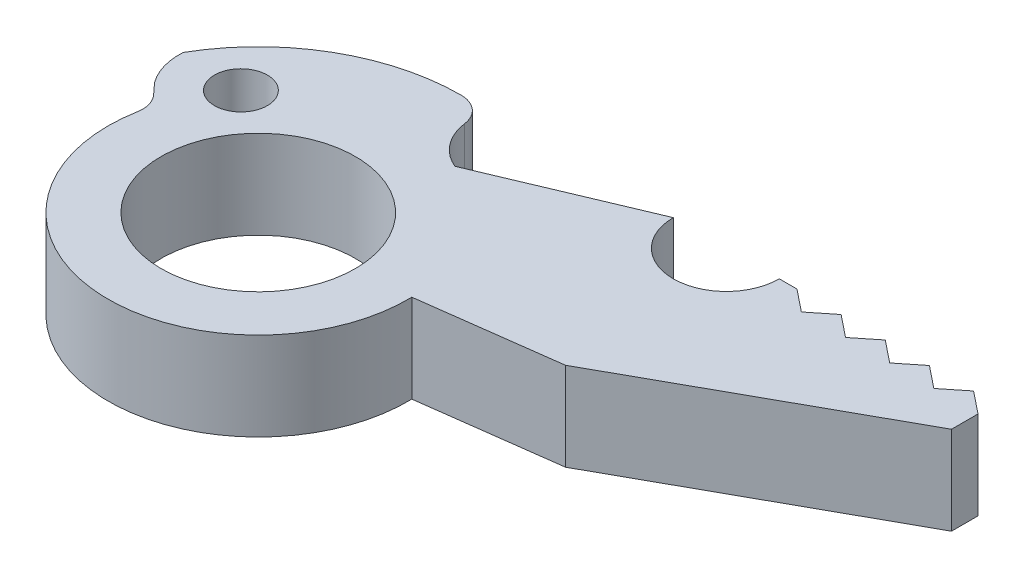
ISO-10303-21;
HEADER;
FILE_DESCRIPTION(('STEP AP214'),'2;1');
FILE_NAME('part.step','',(''),(''),'','','');
FILE_SCHEMA(('AUTOMOTIVE_DESIGN { 1 0 10303 214 1 1 1 1 }'));
ENDSEC;
DATA;
#1=APPLICATION_CONTEXT('core data for automotive mechanical design processes');
#2=APPLICATION_PROTOCOL_DEFINITION('international standard','automotive_design',2000,#1);
#3=PRODUCT_CONTEXT('',#1,'mechanical');
#4=PRODUCT('Part','Part','',(#3));
#5=PRODUCT_RELATED_PRODUCT_CATEGORY('part','',(#4));
#6=PRODUCT_DEFINITION_FORMATION('','',#4);
#7=PRODUCT_DEFINITION_CONTEXT('part definition',#1,'design');
#8=PRODUCT_DEFINITION('design','',#6,#7);
#9=PRODUCT_DEFINITION_SHAPE('','',#8);
#10=(LENGTH_UNIT() NAMED_UNIT(*) SI_UNIT(.MILLI.,.METRE.));
#11=(NAMED_UNIT(*) PLANE_ANGLE_UNIT() SI_UNIT($,.RADIAN.));
#12=(NAMED_UNIT(*) SI_UNIT($,.STERADIAN.) SOLID_ANGLE_UNIT());
#13=UNCERTAINTY_MEASURE_WITH_UNIT(LENGTH_MEASURE(1.E-05),#10,'distance_accuracy_value','');
#14=(GEOMETRIC_REPRESENTATION_CONTEXT(3) GLOBAL_UNCERTAINTY_ASSIGNED_CONTEXT((#13)) GLOBAL_UNIT_ASSIGNED_CONTEXT((#10,
#11,#12)) REPRESENTATION_CONTEXT('',''));
#15=CARTESIAN_POINT('',(0.,0.,0.));
#16=DIRECTION('',(0.,0.,1.));
#17=DIRECTION('',(1.,0.,0.));
#18=AXIS2_PLACEMENT_3D('',#15,#16,#17);
#19=CARTESIAN_POINT('',(0.,5.,0.));
#20=DIRECTION('',(0.,-1.,0.));
#21=DIRECTION('',(0.,0.,-1.));
#22=AXIS2_PLACEMENT_3D('',#19,#20,#21);
#23=CYLINDRICAL_SURFACE('',#22,11.5);
#24=DIRECTION('',(0.,1.,0.));
#25=VECTOR('',#24,1.);
#26=CARTESIAN_POINT('',(-9.9734779076788,0.,-5.72535923982442));
#27=LINE('',#26,#25);
#28=CARTESIAN_POINT('',(-9.9734779076788,0.,-5.72535923982442));
#29=VERTEX_POINT('',#28);
#30=CARTESIAN_POINT('',(-9.9734779076788,5.,-5.72535923982442));
#31=VERTEX_POINT('',#30);
#32=EDGE_CURVE('E50',#29,#31,#27,.T.);
#33=ORIENTED_EDGE('',*,*,#32,.T.);
#34=CARTESIAN_POINT('',(0.,5.,0.));
#35=DIRECTION('',(0.,1.,0.));
#36=DIRECTION('',(0.,0.,1.));
#37=AXIS2_PLACEMENT_3D('',#34,#35,#36);
#38=CIRCLE('',#37,11.5);
#39=CARTESIAN_POINT('',(0.,5.,-11.5));
#40=VERTEX_POINT('',#39);
#41=EDGE_CURVE('E185',#40,#31,#38,.T.);
#42=ORIENTED_EDGE('',*,*,#41,.F.);
#43=DIRECTION('',(0.,-1.,0.));
#44=VECTOR('',#43,1.);
#45=CARTESIAN_POINT('',(0.,5.,-11.5));
#46=LINE('',#45,#44);
#47=CARTESIAN_POINT('',(0.,0.,-11.5));
#48=VERTEX_POINT('',#47);
#49=EDGE_CURVE('E189',#40,#48,#46,.T.);
#50=ORIENTED_EDGE('',*,*,#49,.T.);
#51=CARTESIAN_POINT('',(0.,0.,0.));
#52=DIRECTION('',(0.,1.,0.));
#53=DIRECTION('',(0.,0.,1.));
#54=AXIS2_PLACEMENT_3D('',#51,#52,#53);
#55=CIRCLE('',#54,11.5);
#56=EDGE_CURVE('E307',#48,#29,#55,.T.);
#57=ORIENTED_EDGE('',*,*,#56,.T.);
#58=EDGE_LOOP('',(#33,#42,#50,#57));
#59=FACE_BOUND('',#58,.T.);
#60=ADVANCED_FACE('F35',(#59),#23,.T.);
#61=CARTESIAN_POINT('',(-3.35381852195937,5.,3.06906521636058));
#62=DIRECTION('',(-0.737731126238282,0.,0.675094649200537));
#63=DIRECTION('',(0.675094649200537,0.,0.737731126238282));
#64=AXIS2_PLACEMENT_3D('',#61,#62,#63);
#65=PLANE('',#64);
#66=DIRECTION('',(-0.675094649200537,0.,-0.737731126238282));
#67=VECTOR('',#66,1.);
#68=CARTESIAN_POINT('',(-3.35381852195937,5.,3.06906521636058));
#69=LINE('',#68,#67);
#70=CARTESIAN_POINT('',(-8.73108036714643,5.,-2.80710850509576));
#71=VERTEX_POINT('',#70);
#72=CARTESIAN_POINT('',(-9.31054111356985,5.,-3.44033264570488));
#73=VERTEX_POINT('',#72);
#74=EDGE_CURVE('E194',#71,#73,#69,.T.);
#75=ORIENTED_EDGE('',*,*,#74,.T.);
#76=DIRECTION('',(0.,1.,0.));
#77=VECTOR('',#76,1.);
#78=CARTESIAN_POINT('',(-9.31054111356985,0.,-3.44033264570488));
#79=LINE('',#78,#77);
#80=CARTESIAN_POINT('',(-9.31054111356985,0.,-3.44033264570488));
#81=VERTEX_POINT('',#80);
#82=EDGE_CURVE('E329',#81,#73,#79,.T.);
#83=ORIENTED_EDGE('',*,*,#82,.F.);
#84=DIRECTION('',(-0.675094649200537,0.,-0.737731126238282));
#85=VECTOR('',#84,1.);
#86=CARTESIAN_POINT('',(-3.35381852195937,0.,3.06906521636058));
#87=LINE('',#86,#85);
#88=CARTESIAN_POINT('',(-8.73108036714643,0.,-2.80710850509576));
#89=VERTEX_POINT('',#88);
#90=EDGE_CURVE('E309',#89,#81,#87,.T.);
#91=ORIENTED_EDGE('',*,*,#90,.F.);
#92=DIRECTION('',(0.,-1.,0.));
#93=VECTOR('',#92,1.);
#94=CARTESIAN_POINT('',(-8.73108036714643,5.,-2.80710850509576));
#95=LINE('',#94,#93);
#96=EDGE_CURVE('E208',#71,#89,#95,.T.);
#97=ORIENTED_EDGE('',*,*,#96,.F.);
#98=EDGE_LOOP('',(#75,#83,#91,#97));
#99=FACE_BOUND('',#98,.T.);
#100=ADVANCED_FACE('F337',(#99),#65,.T.);
#101=CARTESIAN_POINT('',(0.,5.,0.));
#102=DIRECTION('',(0.,1.,0.));
#103=DIRECTION('',(0.,0.,1.));
#104=AXIS2_PLACEMENT_3D('',#101,#102,#103);
#105=PLANE('',#104);
#106=CARTESIAN_POINT('',(0.,5.,0.));
#107=DIRECTION('',(0.,1.,0.));
#108=DIRECTION('',(0.,0.,1.));
#109=AXIS2_PLACEMENT_3D('',#106,#107,#108);
#110=CIRCLE('',#109,5.5);
#111=CARTESIAN_POINT('',(0.,5.,5.5));
#112=VERTEX_POINT('',#111);
#113=EDGE_CURVE('E317',#112,#112,#110,.T.);
#114=ORIENTED_EDGE('',*,*,#113,.F.);
#115=EDGE_LOOP('',(#114));
#116=FACE_BOUND('',#115,.T.);
#117=CARTESIAN_POINT('',(-6.48074069840786,5.,-5.5));
#118=DIRECTION('',(0.,1.,0.));
#119=DIRECTION('',(0.,0.,1.));
#120=AXIS2_PLACEMENT_3D('',#117,#118,#119);
#121=CIRCLE('',#120,1.5);
#122=CARTESIAN_POINT('',(-6.48074069840786,5.,-4.));
#123=VERTEX_POINT('',#122);
#124=EDGE_CURVE('E318',#123,#123,#121,.T.);
#125=ORIENTED_EDGE('',*,*,#124,.F.);
#126=EDGE_LOOP('',(#125));
#127=FACE_BOUND('',#126,.T.);
#128=ORIENTED_EDGE('',*,*,#41,.T.);
#129=CARTESIAN_POINT('',(-6.48074069840786,5.,-5.5));
#130=DIRECTION('',(0.,1.,0.));
#131=DIRECTION('',(0.,0.,1.));
#132=AXIS2_PLACEMENT_3D('',#129,#130,#131);
#133=CIRCLE('',#132,3.5);
#134=EDGE_CURVE('E341',#31,#73,#133,.T.);
#135=ORIENTED_EDGE('',*,*,#134,.T.);
#136=ORIENTED_EDGE('',*,*,#74,.F.);
#137=CARTESIAN_POINT('',(-9.83767705650385,5.,-1.79446653129496));
#138=DIRECTION('',(0.,1.,0.));
#139=DIRECTION('',(0.,0.,1.));
#140=AXIS2_PLACEMENT_3D('',#137,#138,#139);
#141=CIRCLE('',#140,1.5);
#142=CARTESIAN_POINT('',(-8.36202549802827,5.,-1.52529655160071));
#143=VERTEX_POINT('',#142);
#144=EDGE_CURVE('E320',#143,#71,#141,.T.);
#145=ORIENTED_EDGE('',*,*,#144,.F.);
#146=CARTESIAN_POINT('',(0.,5.,0.));
#147=DIRECTION('',(0.,1.,0.));
#148=DIRECTION('',(0.,0.,1.));
#149=AXIS2_PLACEMENT_3D('',#146,#147,#148);
#150=CIRCLE('',#149,8.5);
#151=CARTESIAN_POINT('',(8.49770604584843,5.,-0.197463815295299));
#152=VERTEX_POINT('',#151);
#153=EDGE_CURVE('E350',#152,#143,#150,.F.);
#154=ORIENTED_EDGE('',*,*,#153,.F.);
#155=DIRECTION('',(-0.991420251946887,0.,0.13071298340093));
#156=VECTOR('',#155,1.);
#157=CARTESIAN_POINT('',(0.119601188207002,5.,0.907140492552552));
#158=LINE('',#157,#156);
#159=CARTESIAN_POINT('',(16.1869783902135,5.,-1.21124956996442));
#160=VERTEX_POINT('',#159);
#161=EDGE_CURVE('E352',#160,#152,#158,.T.);
#162=ORIENTED_EDGE('',*,*,#161,.F.);
#163=DIRECTION('',(-0.874791356085416,0.,0.484499827985769));
#164=VECTOR('',#163,1.);
#165=CARTESIAN_POINT('',(3.28636116645535,5.,5.9337076616555));
#166=LINE('',#165,#164);
#167=CARTESIAN_POINT('',(30.25,5.,-9.));
#168=VERTEX_POINT('',#167);
#169=EDGE_CURVE('E250',#168,#160,#166,.T.);
#170=ORIENTED_EDGE('',*,*,#169,.F.);
#171=DIRECTION('',(0.,0.,1.));
#172=VECTOR('',#171,1.);
#173=CARTESIAN_POINT('',(30.2500000000001,5.,-2.09901540593194E-13));
#174=LINE('',#173,#172);
#175=CARTESIAN_POINT('',(30.25,5.,-10.5));
#176=VERTEX_POINT('',#175);
#177=EDGE_CURVE('E355',#176,#168,#174,.T.);
#178=ORIENTED_EDGE('',*,*,#177,.F.);
#179=DIRECTION('',(0.78086880944303,0.,0.624695047554424));
#180=VECTOR('',#179,1.);
#181=CARTESIAN_POINT('',(16.9268292682927,5.,-21.1585365853659));
#182=LINE('',#181,#180);
#183=CARTESIAN_POINT('',(29.,5.,-11.5));
#184=VERTEX_POINT('',#183);
#185=EDGE_CURVE('E358',#184,#176,#182,.T.);
#186=ORIENTED_EDGE('',*,*,#185,.F.);
#187=DIRECTION('',(0.780868809443031,0.,-0.624695047554424));
#188=VECTOR('',#187,1.);
#189=CARTESIAN_POINT('',(5.70731707317071,5.,7.1341463414634));
#190=LINE('',#189,#188);
#191=CARTESIAN_POINT('',(27.75,5.,-10.5));
#192=VERTEX_POINT('',#191);
#193=EDGE_CURVE('E361',#192,#184,#190,.T.);
#194=ORIENTED_EDGE('',*,*,#193,.F.);
#195=DIRECTION('',(0.780868809443031,0.,0.624695047554424));
#196=VECTOR('',#195,1.);
#197=CARTESIAN_POINT('',(15.9512195121951,5.,-19.9390243902439));
#198=LINE('',#197,#196);
#199=CARTESIAN_POINT('',(26.5,5.,-11.5));
#200=VERTEX_POINT('',#199);
#201=EDGE_CURVE('E364',#200,#192,#198,.T.);
#202=ORIENTED_EDGE('',*,*,#201,.F.);
#203=DIRECTION('',(0.78086880944303,0.,-0.624695047554425));
#204=VECTOR('',#203,1.);
#205=CARTESIAN_POINT('',(4.73170731707318,5.,5.91463414634147));
#206=LINE('',#205,#204);
#207=CARTESIAN_POINT('',(25.25,5.,-10.5));
#208=VERTEX_POINT('',#207);
#209=EDGE_CURVE('E367',#208,#200,#206,.T.);
#210=ORIENTED_EDGE('',*,*,#209,.F.);
#211=DIRECTION('',(0.780868809443031,0.,0.624695047554424));
#212=VECTOR('',#211,1.);
#213=CARTESIAN_POINT('',(14.9756097560975,5.,-18.719512195122));
#214=LINE('',#213,#212);
#215=CARTESIAN_POINT('',(24.,5.,-11.5));
#216=VERTEX_POINT('',#215);
#217=EDGE_CURVE('E370',#216,#208,#214,.T.);
#218=ORIENTED_EDGE('',*,*,#217,.F.);
#219=DIRECTION('',(0.780868809443031,0.,-0.624695047554424));
#220=VECTOR('',#219,1.);
#221=CARTESIAN_POINT('',(3.75609756097559,5.,4.6951219512195));
#222=LINE('',#221,#220);
#223=CARTESIAN_POINT('',(22.75,5.,-10.5));
#224=VERTEX_POINT('',#223);
#225=EDGE_CURVE('E373',#224,#216,#222,.T.);
#226=ORIENTED_EDGE('',*,*,#225,.F.);
#227=DIRECTION('',(0.78086880944303,0.,0.624695047554425));
#228=VECTOR('',#227,1.);
#229=CARTESIAN_POINT('',(14.,5.,-17.5));
#230=LINE('',#229,#228);
#231=CARTESIAN_POINT('',(21.5,5.,-11.5));
#232=VERTEX_POINT('',#231);
#233=EDGE_CURVE('E376',#232,#224,#230,.T.);
#234=ORIENTED_EDGE('',*,*,#233,.F.);
#235=DIRECTION('',(0.780868809443031,0.,-0.624695047554424));
#236=VECTOR('',#235,1.);
#237=CARTESIAN_POINT('',(2.78048780487803,5.,3.47560975609755));
#238=LINE('',#237,#236);
#239=CARTESIAN_POINT('',(20.25,5.,-10.5));
#240=VERTEX_POINT('',#239);
#241=EDGE_CURVE('E379',#240,#232,#238,.T.);
#242=ORIENTED_EDGE('',*,*,#241,.F.);
#243=DIRECTION('',(0.78086880944303,0.,0.624695047554425));
#244=VECTOR('',#243,1.);
#245=CARTESIAN_POINT('',(13.0243902439025,5.,-16.280487804878));
#246=LINE('',#245,#244);
#247=CARTESIAN_POINT('',(19.,5.,-11.5));
#248=VERTEX_POINT('',#247);
#249=EDGE_CURVE('E382',#248,#240,#246,.T.);
#250=ORIENTED_EDGE('',*,*,#249,.F.);
#251=DIRECTION('',(1.,0.,0.));
#252=VECTOR('',#251,1.);
#253=CARTESIAN_POINT('',(0.,5.,-11.5));
#254=LINE('',#253,#252);
#255=CARTESIAN_POINT('',(18.,5.,-11.5));
#256=VERTEX_POINT('',#255);
#257=EDGE_CURVE('E385',#256,#248,#254,.T.);
#258=ORIENTED_EDGE('',*,*,#257,.F.);
#259=CARTESIAN_POINT('',(15.,5.,-11.5));
#260=DIRECTION('',(0.,1.,0.));
#261=DIRECTION('',(0.,0.,1.));
#262=AXIS2_PLACEMENT_3D('',#259,#260,#261);
#263=CIRCLE('',#262,3.);
#264=CARTESIAN_POINT('',(12.,5.,-11.5));
#265=VERTEX_POINT('',#264);
#266=EDGE_CURVE('E388',#265,#256,#263,.T.);
#267=ORIENTED_EDGE('',*,*,#266,.F.);
#268=DIRECTION('',(-0.921614956126948,0.,0.388105491642574));
#269=VECTOR('',#268,1.);
#270=CARTESIAN_POINT('',(-2.30585352328969,5.,-5.47559655677049));
#271=LINE('',#270,#269);
#272=CARTESIAN_POINT('',(3.2963891570141,5.,-7.83478260869565));
#273=VERTEX_POINT('',#272);
#274=EDGE_CURVE('E391',#265,#273,#271,.T.);
#275=ORIENTED_EDGE('',*,*,#274,.T.);
#276=CARTESIAN_POINT('',(4.45982062419555,5.,-10.6));
#277=DIRECTION('',(0.,1.,0.));
#278=DIRECTION('',(0.,0.,1.));
#279=AXIS2_PLACEMENT_3D('',#276,#277,#278);
#280=CIRCLE('',#279,3.);
#281=CARTESIAN_POINT('',(1.48660687473185,5.,-10.2));
#282=VERTEX_POINT('',#281);
#283=EDGE_CURVE('E201',#282,#273,#280,.T.);
#284=ORIENTED_EDGE('',*,*,#283,.F.);
#285=CARTESIAN_POINT('',(0.,5.,-10.));
#286=DIRECTION('',(0.,1.,0.));
#287=DIRECTION('',(0.,0.,1.));
#288=AXIS2_PLACEMENT_3D('',#285,#286,#287);
#289=CIRCLE('',#288,1.5);
#290=EDGE_CURVE('E195',#282,#40,#289,.T.);
#291=ORIENTED_EDGE('',*,*,#290,.T.);
#292=EDGE_LOOP('',(#128,#135,#136,#145,#154,#162,#170,#178,#186,#194,#202,#210,#218,#226,#234,
#242,#250,#258,#267,#275,#284,#291));
#293=FACE_BOUND('',#292,.T.);
#294=ADVANCED_FACE('F199',(#116,#127,#293),#105,.T.);
#295=CARTESIAN_POINT('',(0.,0.,0.));
#296=DIRECTION('',(0.,1.,0.));
#297=DIRECTION('',(0.,0.,1.));
#298=AXIS2_PLACEMENT_3D('',#295,#296,#297);
#299=PLANE('',#298);
#300=CARTESIAN_POINT('',(-6.48074069840786,0.,-5.5));
#301=DIRECTION('',(0.,1.,0.));
#302=DIRECTION('',(0.,0.,1.));
#303=AXIS2_PLACEMENT_3D('',#300,#301,#302);
#304=CIRCLE('',#303,1.5);
#305=CARTESIAN_POINT('',(-6.48074069840786,0.,-4.));
#306=VERTEX_POINT('',#305);
#307=EDGE_CURVE('E315',#306,#306,#304,.T.);
#308=ORIENTED_EDGE('',*,*,#307,.T.);
#309=EDGE_LOOP('',(#308));
#310=FACE_BOUND('',#309,.T.);
#311=CARTESIAN_POINT('',(0.,0.,0.));
#312=DIRECTION('',(0.,1.,0.));
#313=DIRECTION('',(0.,0.,1.));
#314=AXIS2_PLACEMENT_3D('',#311,#312,#313);
#315=CIRCLE('',#314,5.5);
#316=CARTESIAN_POINT('',(0.,0.,5.5));
#317=VERTEX_POINT('',#316);
#318=EDGE_CURVE('E327',#317,#317,#315,.T.);
#319=ORIENTED_EDGE('',*,*,#318,.T.);
#320=EDGE_LOOP('',(#319));
#321=FACE_BOUND('',#320,.T.);
#322=CARTESIAN_POINT('',(-6.48074069840786,0.,-5.5));
#323=DIRECTION('',(0.,1.,0.));
#324=DIRECTION('',(0.,0.,1.));
#325=AXIS2_PLACEMENT_3D('',#322,#323,#324);
#326=CIRCLE('',#325,3.5);
#327=EDGE_CURVE('E339',#29,#81,#326,.T.);
#328=ORIENTED_EDGE('',*,*,#327,.F.);
#329=ORIENTED_EDGE('',*,*,#56,.F.);
#330=CARTESIAN_POINT('',(0.,0.,-10.));
#331=DIRECTION('',(0.,1.,0.));
#332=DIRECTION('',(0.,0.,1.));
#333=AXIS2_PLACEMENT_3D('',#330,#331,#332);
#334=CIRCLE('',#333,1.5);
#335=CARTESIAN_POINT('',(1.48660687473185,0.,-10.2));
#336=VERTEX_POINT('',#335);
#337=EDGE_CURVE('E206',#336,#48,#334,.T.);
#338=ORIENTED_EDGE('',*,*,#337,.F.);
#339=CARTESIAN_POINT('',(4.45982062419555,0.,-10.6));
#340=DIRECTION('',(0.,1.,0.));
#341=DIRECTION('',(0.,0.,1.));
#342=AXIS2_PLACEMENT_3D('',#339,#340,#341);
#343=CIRCLE('',#342,3.);
#344=CARTESIAN_POINT('',(3.2963891570141,0.,-7.83478260869565));
#345=VERTEX_POINT('',#344);
#346=EDGE_CURVE('E303',#336,#345,#343,.T.);
#347=ORIENTED_EDGE('',*,*,#346,.T.);
#348=DIRECTION('',(-0.921614956126948,0.,0.388105491642574));
#349=VECTOR('',#348,1.);
#350=CARTESIAN_POINT('',(-2.30585352328969,0.,-5.47559655677049));
#351=LINE('',#350,#349);
#352=CARTESIAN_POINT('',(12.,0.,-11.5));
#353=VERTEX_POINT('',#352);
#354=EDGE_CURVE('E300',#353,#345,#351,.T.);
#355=ORIENTED_EDGE('',*,*,#354,.F.);
#356=CARTESIAN_POINT('',(15.,0.,-11.5));
#357=DIRECTION('',(0.,1.,0.));
#358=DIRECTION('',(0.,0.,1.));
#359=AXIS2_PLACEMENT_3D('',#356,#357,#358);
#360=CIRCLE('',#359,3.);
#361=CARTESIAN_POINT('',(18.,0.,-11.5));
#362=VERTEX_POINT('',#361);
#363=EDGE_CURVE('E297',#353,#362,#360,.T.);
#364=ORIENTED_EDGE('',*,*,#363,.T.);
#365=DIRECTION('',(1.,0.,0.));
#366=VECTOR('',#365,1.);
#367=CARTESIAN_POINT('',(0.,0.,-11.5));
#368=LINE('',#367,#366);
#369=CARTESIAN_POINT('',(19.,0.,-11.5));
#370=VERTEX_POINT('',#369);
#371=EDGE_CURVE('E294',#362,#370,#368,.T.);
#372=ORIENTED_EDGE('',*,*,#371,.T.);
#373=DIRECTION('',(0.78086880944303,0.,0.624695047554425));
#374=VECTOR('',#373,1.);
#375=CARTESIAN_POINT('',(13.0243902439025,0.,-16.280487804878));
#376=LINE('',#375,#374);
#377=CARTESIAN_POINT('',(20.25,0.,-10.5));
#378=VERTEX_POINT('',#377);
#379=EDGE_CURVE('E291',#370,#378,#376,.T.);
#380=ORIENTED_EDGE('',*,*,#379,.T.);
#381=DIRECTION('',(0.780868809443031,0.,-0.624695047554424));
#382=VECTOR('',#381,1.);
#383=CARTESIAN_POINT('',(2.78048780487803,0.,3.47560975609755));
#384=LINE('',#383,#382);
#385=CARTESIAN_POINT('',(21.5,0.,-11.5));
#386=VERTEX_POINT('',#385);
#387=EDGE_CURVE('E288',#378,#386,#384,.T.);
#388=ORIENTED_EDGE('',*,*,#387,.T.);
#389=DIRECTION('',(0.78086880944303,0.,0.624695047554425));
#390=VECTOR('',#389,1.);
#391=CARTESIAN_POINT('',(14.,0.,-17.5));
#392=LINE('',#391,#390);
#393=CARTESIAN_POINT('',(22.75,0.,-10.5));
#394=VERTEX_POINT('',#393);
#395=EDGE_CURVE('E285',#386,#394,#392,.T.);
#396=ORIENTED_EDGE('',*,*,#395,.T.);
#397=DIRECTION('',(0.780868809443031,0.,-0.624695047554424));
#398=VECTOR('',#397,1.);
#399=CARTESIAN_POINT('',(3.75609756097559,0.,4.6951219512195));
#400=LINE('',#399,#398);
#401=CARTESIAN_POINT('',(24.,0.,-11.5));
#402=VERTEX_POINT('',#401);
#403=EDGE_CURVE('E282',#394,#402,#400,.T.);
#404=ORIENTED_EDGE('',*,*,#403,.T.);
#405=DIRECTION('',(0.780868809443031,0.,0.624695047554424));
#406=VECTOR('',#405,1.);
#407=CARTESIAN_POINT('',(14.9756097560975,0.,-18.719512195122));
#408=LINE('',#407,#406);
#409=CARTESIAN_POINT('',(25.25,0.,-10.5));
#410=VERTEX_POINT('',#409);
#411=EDGE_CURVE('E279',#402,#410,#408,.T.);
#412=ORIENTED_EDGE('',*,*,#411,.T.);
#413=DIRECTION('',(0.78086880944303,0.,-0.624695047554425));
#414=VECTOR('',#413,1.);
#415=CARTESIAN_POINT('',(4.73170731707318,0.,5.91463414634147));
#416=LINE('',#415,#414);
#417=CARTESIAN_POINT('',(26.5,0.,-11.5));
#418=VERTEX_POINT('',#417);
#419=EDGE_CURVE('E276',#410,#418,#416,.T.);
#420=ORIENTED_EDGE('',*,*,#419,.T.);
#421=DIRECTION('',(0.780868809443031,0.,0.624695047554424));
#422=VECTOR('',#421,1.);
#423=CARTESIAN_POINT('',(15.9512195121951,0.,-19.9390243902439));
#424=LINE('',#423,#422);
#425=CARTESIAN_POINT('',(27.75,0.,-10.5));
#426=VERTEX_POINT('',#425);
#427=EDGE_CURVE('E273',#418,#426,#424,.T.);
#428=ORIENTED_EDGE('',*,*,#427,.T.);
#429=DIRECTION('',(0.780868809443031,0.,-0.624695047554424));
#430=VECTOR('',#429,1.);
#431=CARTESIAN_POINT('',(5.70731707317071,0.,7.1341463414634));
#432=LINE('',#431,#430);
#433=CARTESIAN_POINT('',(29.,0.,-11.5));
#434=VERTEX_POINT('',#433);
#435=EDGE_CURVE('E270',#426,#434,#432,.T.);
#436=ORIENTED_EDGE('',*,*,#435,.T.);
#437=DIRECTION('',(0.78086880944303,0.,0.624695047554424));
#438=VECTOR('',#437,1.);
#439=CARTESIAN_POINT('',(16.9268292682927,0.,-21.1585365853659));
#440=LINE('',#439,#438);
#441=CARTESIAN_POINT('',(30.25,0.,-10.5));
#442=VERTEX_POINT('',#441);
#443=EDGE_CURVE('E265',#434,#442,#440,.T.);
#444=ORIENTED_EDGE('',*,*,#443,.T.);
#445=DIRECTION('',(0.,0.,1.));
#446=VECTOR('',#445,1.);
#447=CARTESIAN_POINT('',(30.2500000000001,0.,-2.09901540593194E-13));
#448=LINE('',#447,#446);
#449=CARTESIAN_POINT('',(30.25,0.,-9.));
#450=VERTEX_POINT('',#449);
#451=EDGE_CURVE('E263',#442,#450,#448,.T.);
#452=ORIENTED_EDGE('',*,*,#451,.T.);
#453=DIRECTION('',(-0.874791356085416,0.,0.484499827985769));
#454=VECTOR('',#453,1.);
#455=CARTESIAN_POINT('',(3.28636116645535,0.,5.9337076616555));
#456=LINE('',#455,#454);
#457=CARTESIAN_POINT('',(16.1869783902135,0.,-1.21124956996442));
#458=VERTEX_POINT('',#457);
#459=EDGE_CURVE('E247',#450,#458,#456,.T.);
#460=ORIENTED_EDGE('',*,*,#459,.T.);
#461=DIRECTION('',(-0.991420251946887,0.,0.13071298340093));
#462=VECTOR('',#461,1.);
#463=CARTESIAN_POINT('',(0.119601188207002,0.,0.907140492552552));
#464=LINE('',#463,#462);
#465=CARTESIAN_POINT('',(8.49770604584843,0.,-0.197463815295299));
#466=VERTEX_POINT('',#465);
#467=EDGE_CURVE('E255',#458,#466,#464,.T.);
#468=ORIENTED_EDGE('',*,*,#467,.T.);
#469=CARTESIAN_POINT('',(0.,0.,0.));
#470=DIRECTION('',(0.,1.,0.));
#471=DIRECTION('',(0.,0.,1.));
#472=AXIS2_PLACEMENT_3D('',#469,#470,#471);
#473=CIRCLE('',#472,8.5);
#474=CARTESIAN_POINT('',(-8.36202549802827,0.,-1.52529655160071));
#475=VERTEX_POINT('',#474);
#476=EDGE_CURVE('E258',#466,#475,#473,.F.);
#477=ORIENTED_EDGE('',*,*,#476,.T.);
#478=CARTESIAN_POINT('',(-9.83767705650385,0.,-1.79446653129496));
#479=DIRECTION('',(0.,1.,0.));
#480=DIRECTION('',(0.,0.,1.));
#481=AXIS2_PLACEMENT_3D('',#478,#479,#480);
#482=CIRCLE('',#481,1.5);
#483=EDGE_CURVE('E312',#475,#89,#482,.T.);
#484=ORIENTED_EDGE('',*,*,#483,.T.);
#485=ORIENTED_EDGE('',*,*,#90,.T.);
#486=EDGE_LOOP('',(#328,#329,#338,#347,#355,#364,#372,#380,#388,#396,#404,#412,#420,#428,#436,
#444,#452,#460,#468,#477,#484,#485));
#487=FACE_BOUND('',#486,.T.);
#488=ADVANCED_FACE('F260',(#310,#321,#487),#299,.F.);
#489=CARTESIAN_POINT('',(0.,5.,0.));
#490=DIRECTION('',(0.,-1.,0.));
#491=DIRECTION('',(0.,0.,-1.));
#492=AXIS2_PLACEMENT_3D('',#489,#490,#491);
#493=CYLINDRICAL_SURFACE('',#492,8.5);
#494=ORIENTED_EDGE('',*,*,#476,.F.);
#495=DIRECTION('',(0.,-1.,0.));
#496=VECTOR('',#495,1.);
#497=CARTESIAN_POINT('',(8.49770604584843,5.,-0.197463815295299));
#498=LINE('',#497,#496);
#499=EDGE_CURVE('E11',#152,#466,#498,.T.);
#500=ORIENTED_EDGE('',*,*,#499,.F.);
#501=ORIENTED_EDGE('',*,*,#153,.T.);
#502=DIRECTION('',(0.,-1.,0.));
#503=VECTOR('',#502,1.);
#504=CARTESIAN_POINT('',(-8.36202549802827,5.,-1.52529655160071));
#505=LINE('',#504,#503);
#506=EDGE_CURVE('E59',#143,#475,#505,.T.);
#507=ORIENTED_EDGE('',*,*,#506,.T.);
#508=EDGE_LOOP('',(#494,#500,#501,#507));
#509=FACE_BOUND('',#508,.T.);
#510=ADVANCED_FACE('F393',(#509),#493,.T.);
#511=CARTESIAN_POINT('',(0.119601188207002,5.,0.907140492552552));
#512=DIRECTION('',(0.13071298340093,0.,0.991420251946887));
#513=DIRECTION('',(0.991420251946887,0.,-0.13071298340093));
#514=AXIS2_PLACEMENT_3D('',#511,#512,#513);
#515=PLANE('',#514);
#516=ORIENTED_EDGE('',*,*,#467,.F.);
#517=DIRECTION('',(0.,-1.,0.));
#518=VECTOR('',#517,1.);
#519=CARTESIAN_POINT('',(16.1869783902135,5.,-1.21124956996442));
#520=LINE('',#519,#518);
#521=EDGE_CURVE('E43',#160,#458,#520,.T.);
#522=ORIENTED_EDGE('',*,*,#521,.F.);
#523=ORIENTED_EDGE('',*,*,#161,.T.);
#524=ORIENTED_EDGE('',*,*,#499,.T.);
#525=EDGE_LOOP('',(#516,#522,#523,#524));
#526=FACE_BOUND('',#525,.T.);
#527=ADVANCED_FACE('F256',(#526),#515,.T.);
#528=CARTESIAN_POINT('',(3.28636116645535,5.,5.9337076616555));
#529=DIRECTION('',(0.484499827985769,0.,0.874791356085416));
#530=DIRECTION('',(0.874791356085416,0.,-0.484499827985769));
#531=AXIS2_PLACEMENT_3D('',#528,#529,#530);
#532=PLANE('',#531);
#533=ORIENTED_EDGE('',*,*,#459,.F.);
#534=DIRECTION('',(0.,-1.,0.));
#535=VECTOR('',#534,1.);
#536=CARTESIAN_POINT('',(30.25,5.,-9.));
#537=LINE('',#536,#535);
#538=EDGE_CURVE('E240',#168,#450,#537,.T.);
#539=ORIENTED_EDGE('',*,*,#538,.F.);
#540=ORIENTED_EDGE('',*,*,#169,.T.);
#541=ORIENTED_EDGE('',*,*,#521,.T.);
#542=EDGE_LOOP('',(#533,#539,#540,#541));
#543=FACE_BOUND('',#542,.T.);
#544=ADVANCED_FACE('F245',(#543),#532,.T.);
#545=CARTESIAN_POINT('',(30.2500000000001,5.,-2.09901540593194E-13));
#546=DIRECTION('',(1.,0.,0.));
#547=DIRECTION('',(0.,0.,-1.));
#548=AXIS2_PLACEMENT_3D('',#545,#546,#547);
#549=PLANE('',#548);
#550=ORIENTED_EDGE('',*,*,#451,.F.);
#551=DIRECTION('',(0.,-1.,0.));
#552=VECTOR('',#551,1.);
#553=CARTESIAN_POINT('',(30.25,5.,-10.5));
#554=LINE('',#553,#552);
#555=EDGE_CURVE('E238',#176,#442,#554,.T.);
#556=ORIENTED_EDGE('',*,*,#555,.F.);
#557=ORIENTED_EDGE('',*,*,#177,.T.);
#558=ORIENTED_EDGE('',*,*,#538,.T.);
#559=EDGE_LOOP('',(#550,#556,#557,#558));
#560=FACE_BOUND('',#559,.T.);
#561=ADVANCED_FACE('F464',(#560),#549,.T.);
#562=CARTESIAN_POINT('',(16.9268292682927,5.,-21.1585365853659));
#563=DIRECTION('',(0.624695047554424,0.,-0.78086880944303));
#564=DIRECTION('',(-0.78086880944303,0.,-0.624695047554424));
#565=AXIS2_PLACEMENT_3D('',#562,#563,#564);
#566=PLANE('',#565);
#567=ORIENTED_EDGE('',*,*,#443,.F.);
#568=DIRECTION('',(0.,-1.,0.));
#569=VECTOR('',#568,1.);
#570=CARTESIAN_POINT('',(29.,5.,-11.5));
#571=LINE('',#570,#569);
#572=EDGE_CURVE('E236',#184,#434,#571,.T.);
#573=ORIENTED_EDGE('',*,*,#572,.F.);
#574=ORIENTED_EDGE('',*,*,#185,.T.);
#575=ORIENTED_EDGE('',*,*,#555,.T.);
#576=EDGE_LOOP('',(#567,#573,#574,#575));
#577=FACE_BOUND('',#576,.T.);
#578=ADVANCED_FACE('F460',(#577),#566,.T.);
#579=CARTESIAN_POINT('',(5.70731707317071,5.,7.1341463414634));
#580=DIRECTION('',(-0.624695047554424,0.,-0.780868809443031));
#581=DIRECTION('',(-0.780868809443031,0.,0.624695047554424));
#582=AXIS2_PLACEMENT_3D('',#579,#580,#581);
#583=PLANE('',#582);
#584=ORIENTED_EDGE('',*,*,#435,.F.);
#585=DIRECTION('',(0.,-1.,0.));
#586=VECTOR('',#585,1.);
#587=CARTESIAN_POINT('',(27.75,5.,-10.5));
#588=LINE('',#587,#586);
#589=EDGE_CURVE('E234',#192,#426,#588,.T.);
#590=ORIENTED_EDGE('',*,*,#589,.F.);
#591=ORIENTED_EDGE('',*,*,#193,.T.);
#592=ORIENTED_EDGE('',*,*,#572,.T.);
#593=EDGE_LOOP('',(#584,#590,#591,#592));
#594=FACE_BOUND('',#593,.T.);
#595=ADVANCED_FACE('F456',(#594),#583,.T.);
#596=CARTESIAN_POINT('',(15.9512195121951,5.,-19.9390243902439));
#597=DIRECTION('',(0.624695047554424,0.,-0.780868809443031));
#598=DIRECTION('',(-0.780868809443031,0.,-0.624695047554424));
#599=AXIS2_PLACEMENT_3D('',#596,#597,#598);
#600=PLANE('',#599);
#601=ORIENTED_EDGE('',*,*,#427,.F.);
#602=DIRECTION('',(0.,-1.,0.));
#603=VECTOR('',#602,1.);
#604=CARTESIAN_POINT('',(26.5,5.,-11.5));
#605=LINE('',#604,#603);
#606=EDGE_CURVE('E232',#200,#418,#605,.T.);
#607=ORIENTED_EDGE('',*,*,#606,.F.);
#608=ORIENTED_EDGE('',*,*,#201,.T.);
#609=ORIENTED_EDGE('',*,*,#589,.T.);
#610=EDGE_LOOP('',(#601,#607,#608,#609));
#611=FACE_BOUND('',#610,.T.);
#612=ADVANCED_FACE('F452',(#611),#600,.T.);
#613=CARTESIAN_POINT('',(4.73170731707318,5.,5.91463414634147));
#614=DIRECTION('',(-0.624695047554425,0.,-0.78086880944303));
#615=DIRECTION('',(-0.78086880944303,0.,0.624695047554425));
#616=AXIS2_PLACEMENT_3D('',#613,#614,#615);
#617=PLANE('',#616);
#618=ORIENTED_EDGE('',*,*,#419,.F.);
#619=DIRECTION('',(0.,-1.,0.));
#620=VECTOR('',#619,1.);
#621=CARTESIAN_POINT('',(25.25,5.,-10.5));
#622=LINE('',#621,#620);
#623=EDGE_CURVE('E230',#208,#410,#622,.T.);
#624=ORIENTED_EDGE('',*,*,#623,.F.);
#625=ORIENTED_EDGE('',*,*,#209,.T.);
#626=ORIENTED_EDGE('',*,*,#606,.T.);
#627=EDGE_LOOP('',(#618,#624,#625,#626));
#628=FACE_BOUND('',#627,.T.);
#629=ADVANCED_FACE('F448',(#628),#617,.T.);
#630=CARTESIAN_POINT('',(14.9756097560975,5.,-18.719512195122));
#631=DIRECTION('',(0.624695047554424,0.,-0.780868809443031));
#632=DIRECTION('',(-0.780868809443031,0.,-0.624695047554424));
#633=AXIS2_PLACEMENT_3D('',#630,#631,#632);
#634=PLANE('',#633);
#635=ORIENTED_EDGE('',*,*,#411,.F.);
#636=DIRECTION('',(0.,-1.,0.));
#637=VECTOR('',#636,1.);
#638=CARTESIAN_POINT('',(24.,5.,-11.5));
#639=LINE('',#638,#637);
#640=EDGE_CURVE('E228',#216,#402,#639,.T.);
#641=ORIENTED_EDGE('',*,*,#640,.F.);
#642=ORIENTED_EDGE('',*,*,#217,.T.);
#643=ORIENTED_EDGE('',*,*,#623,.T.);
#644=EDGE_LOOP('',(#635,#641,#642,#643));
#645=FACE_BOUND('',#644,.T.);
#646=ADVANCED_FACE('F444',(#645),#634,.T.);
#647=CARTESIAN_POINT('',(3.75609756097559,5.,4.6951219512195));
#648=DIRECTION('',(-0.624695047554424,0.,-0.780868809443031));
#649=DIRECTION('',(-0.780868809443031,0.,0.624695047554424));
#650=AXIS2_PLACEMENT_3D('',#647,#648,#649);
#651=PLANE('',#650);
#652=ORIENTED_EDGE('',*,*,#403,.F.);
#653=DIRECTION('',(0.,-1.,0.));
#654=VECTOR('',#653,1.);
#655=CARTESIAN_POINT('',(22.75,5.,-10.5));
#656=LINE('',#655,#654);
#657=EDGE_CURVE('E226',#224,#394,#656,.T.);
#658=ORIENTED_EDGE('',*,*,#657,.F.);
#659=ORIENTED_EDGE('',*,*,#225,.T.);
#660=ORIENTED_EDGE('',*,*,#640,.T.);
#661=EDGE_LOOP('',(#652,#658,#659,#660));
#662=FACE_BOUND('',#661,.T.);
#663=ADVANCED_FACE('F440',(#662),#651,.T.);
#664=CARTESIAN_POINT('',(14.,5.,-17.5));
#665=DIRECTION('',(0.624695047554425,0.,-0.78086880944303));
#666=DIRECTION('',(-0.78086880944303,0.,-0.624695047554425));
#667=AXIS2_PLACEMENT_3D('',#664,#665,#666);
#668=PLANE('',#667);
#669=ORIENTED_EDGE('',*,*,#395,.F.);
#670=DIRECTION('',(0.,-1.,0.));
#671=VECTOR('',#670,1.);
#672=CARTESIAN_POINT('',(21.5,5.,-11.5));
#673=LINE('',#672,#671);
#674=EDGE_CURVE('E224',#232,#386,#673,.T.);
#675=ORIENTED_EDGE('',*,*,#674,.F.);
#676=ORIENTED_EDGE('',*,*,#233,.T.);
#677=ORIENTED_EDGE('',*,*,#657,.T.);
#678=EDGE_LOOP('',(#669,#675,#676,#677));
#679=FACE_BOUND('',#678,.T.);
#680=ADVANCED_FACE('F436',(#679),#668,.T.);
#681=CARTESIAN_POINT('',(2.78048780487803,5.,3.47560975609755));
#682=DIRECTION('',(-0.624695047554424,0.,-0.780868809443031));
#683=DIRECTION('',(-0.780868809443031,0.,0.624695047554424));
#684=AXIS2_PLACEMENT_3D('',#681,#682,#683);
#685=PLANE('',#684);
#686=ORIENTED_EDGE('',*,*,#387,.F.);
#687=DIRECTION('',(0.,-1.,0.));
#688=VECTOR('',#687,1.);
#689=CARTESIAN_POINT('',(20.25,5.,-10.5));
#690=LINE('',#689,#688);
#691=EDGE_CURVE('E222',#240,#378,#690,.T.);
#692=ORIENTED_EDGE('',*,*,#691,.F.);
#693=ORIENTED_EDGE('',*,*,#241,.T.);
#694=ORIENTED_EDGE('',*,*,#674,.T.);
#695=EDGE_LOOP('',(#686,#692,#693,#694));
#696=FACE_BOUND('',#695,.T.);
#697=ADVANCED_FACE('F432',(#696),#685,.T.);
#698=CARTESIAN_POINT('',(13.0243902439025,5.,-16.280487804878));
#699=DIRECTION('',(0.624695047554425,0.,-0.78086880944303));
#700=DIRECTION('',(-0.78086880944303,0.,-0.624695047554425));
#701=AXIS2_PLACEMENT_3D('',#698,#699,#700);
#702=PLANE('',#701);
#703=ORIENTED_EDGE('',*,*,#379,.F.);
#704=DIRECTION('',(0.,-1.,0.));
#705=VECTOR('',#704,1.);
#706=CARTESIAN_POINT('',(19.,5.,-11.5));
#707=LINE('',#706,#705);
#708=EDGE_CURVE('E220',#248,#370,#707,.T.);
#709=ORIENTED_EDGE('',*,*,#708,.F.);
#710=ORIENTED_EDGE('',*,*,#249,.T.);
#711=ORIENTED_EDGE('',*,*,#691,.T.);
#712=EDGE_LOOP('',(#703,#709,#710,#711));
#713=FACE_BOUND('',#712,.T.);
#714=ADVANCED_FACE('F428',(#713),#702,.T.);
#715=CARTESIAN_POINT('',(0.,5.,-11.5));
#716=DIRECTION('',(0.,0.,-1.));
#717=DIRECTION('',(-1.,0.,0.));
#718=AXIS2_PLACEMENT_3D('',#715,#716,#717);
#719=PLANE('',#718);
#720=ORIENTED_EDGE('',*,*,#371,.F.);
#721=DIRECTION('',(0.,-1.,0.));
#722=VECTOR('',#721,1.);
#723=CARTESIAN_POINT('',(18.,5.,-11.5));
#724=LINE('',#723,#722);
#725=EDGE_CURVE('E218',#256,#362,#724,.T.);
#726=ORIENTED_EDGE('',*,*,#725,.F.);
#727=ORIENTED_EDGE('',*,*,#257,.T.);
#728=ORIENTED_EDGE('',*,*,#708,.T.);
#729=EDGE_LOOP('',(#720,#726,#727,#728));
#730=FACE_BOUND('',#729,.T.);
#731=ADVANCED_FACE('F424',(#730),#719,.T.);
#732=CARTESIAN_POINT('',(15.,5.,-11.5));
#733=DIRECTION('',(0.,-1.,0.));
#734=DIRECTION('',(0.,0.,-1.));
#735=AXIS2_PLACEMENT_3D('',#732,#733,#734);
#736=CYLINDRICAL_SURFACE('',#735,3.);
#737=ORIENTED_EDGE('',*,*,#363,.F.);
#738=DIRECTION('',(0.,-1.,0.));
#739=VECTOR('',#738,1.);
#740=CARTESIAN_POINT('',(12.,5.,-11.5));
#741=LINE('',#740,#739);
#742=EDGE_CURVE('E216',#265,#353,#741,.T.);
#743=ORIENTED_EDGE('',*,*,#742,.F.);
#744=ORIENTED_EDGE('',*,*,#266,.T.);
#745=ORIENTED_EDGE('',*,*,#725,.T.);
#746=EDGE_LOOP('',(#737,#743,#744,#745));
#747=FACE_BOUND('',#746,.T.);
#748=ADVANCED_FACE('F420',(#747),#736,.F.);
#749=CARTESIAN_POINT('',(-2.30585352328969,5.,-5.47559655677049));
#750=DIRECTION('',(0.388105491642574,0.,0.921614956126948));
#751=DIRECTION('',(0.921614956126948,0.,-0.388105491642574));
#752=AXIS2_PLACEMENT_3D('',#749,#750,#751);
#753=PLANE('',#752);
#754=ORIENTED_EDGE('',*,*,#354,.T.);
#755=DIRECTION('',(0.,-1.,0.));
#756=VECTOR('',#755,1.);
#757=CARTESIAN_POINT('',(3.2963891570141,5.,-7.83478260869565));
#758=LINE('',#757,#756);
#759=EDGE_CURVE('E210',#273,#345,#758,.T.);
#760=ORIENTED_EDGE('',*,*,#759,.F.);
#761=ORIENTED_EDGE('',*,*,#274,.F.);
#762=ORIENTED_EDGE('',*,*,#742,.T.);
#763=EDGE_LOOP('',(#754,#760,#761,#762));
#764=FACE_BOUND('',#763,.T.);
#765=ADVANCED_FACE('F416',(#764),#753,.F.);
#766=CARTESIAN_POINT('',(4.45982062419555,5.,-10.6));
#767=DIRECTION('',(0.,-1.,0.));
#768=DIRECTION('',(0.,0.,-1.));
#769=AXIS2_PLACEMENT_3D('',#766,#767,#768);
#770=CYLINDRICAL_SURFACE('',#769,3.);
#771=ORIENTED_EDGE('',*,*,#346,.F.);
#772=DIRECTION('',(0.,-1.,0.));
#773=VECTOR('',#772,1.);
#774=CARTESIAN_POINT('',(1.48660687473185,5.,-10.2));
#775=LINE('',#774,#773);
#776=EDGE_CURVE('E207',#282,#336,#775,.T.);
#777=ORIENTED_EDGE('',*,*,#776,.F.);
#778=ORIENTED_EDGE('',*,*,#283,.T.);
#779=ORIENTED_EDGE('',*,*,#759,.T.);
#780=EDGE_LOOP('',(#771,#777,#778,#779));
#781=FACE_BOUND('',#780,.T.);
#782=ADVANCED_FACE('F413',(#781),#770,.F.);
#783=CARTESIAN_POINT('',(0.,5.,-10.));
#784=DIRECTION('',(0.,-1.,0.));
#785=DIRECTION('',(0.,0.,-1.));
#786=AXIS2_PLACEMENT_3D('',#783,#784,#785);
#787=CYLINDRICAL_SURFACE('',#786,1.5);
#788=ORIENTED_EDGE('',*,*,#337,.T.);
#789=ORIENTED_EDGE('',*,*,#49,.F.);
#790=ORIENTED_EDGE('',*,*,#290,.F.);
#791=ORIENTED_EDGE('',*,*,#776,.T.);
#792=EDGE_LOOP('',(#788,#789,#790,#791));
#793=FACE_BOUND('',#792,.T.);
#794=ADVANCED_FACE('F204',(#793),#787,.T.);
#795=CARTESIAN_POINT('',(-9.83767705650385,5.,-1.79446653129496));
#796=DIRECTION('',(0.,-1.,0.));
#797=DIRECTION('',(0.,0.,-1.));
#798=AXIS2_PLACEMENT_3D('',#795,#796,#797);
#799=CYLINDRICAL_SURFACE('',#798,1.5);
#800=ORIENTED_EDGE('',*,*,#483,.F.);
#801=ORIENTED_EDGE('',*,*,#506,.F.);
#802=ORIENTED_EDGE('',*,*,#144,.T.);
#803=ORIENTED_EDGE('',*,*,#96,.T.);
#804=EDGE_LOOP('',(#800,#801,#802,#803));
#805=FACE_BOUND('',#804,.T.);
#806=ADVANCED_FACE('F330',(#805),#799,.F.);
#807=CARTESIAN_POINT('',(0.,5.,0.));
#808=DIRECTION('',(0.,-1.,0.));
#809=DIRECTION('',(0.,0.,-1.));
#810=AXIS2_PLACEMENT_3D('',#807,#808,#809);
#811=CYLINDRICAL_SURFACE('',#810,5.5);
#812=ORIENTED_EDGE('',*,*,#113,.T.);
#813=EDGE_LOOP('',(#812));
#814=FACE_BOUND('',#813,.T.);
#815=ORIENTED_EDGE('',*,*,#318,.F.);
#816=EDGE_LOOP('',(#815));
#817=FACE_BOUND('',#816,.T.);
#818=ADVANCED_FACE('F37',(#814,#817),#811,.F.);
#819=CARTESIAN_POINT('',(-6.48074069840786,5.,-5.5));
#820=DIRECTION('',(0.,-1.,0.));
#821=DIRECTION('',(0.,0.,-1.));
#822=AXIS2_PLACEMENT_3D('',#819,#820,#821);
#823=CYLINDRICAL_SURFACE('',#822,1.5);
#824=ORIENTED_EDGE('',*,*,#124,.T.);
#825=EDGE_LOOP('',(#824));
#826=FACE_BOUND('',#825,.T.);
#827=ORIENTED_EDGE('',*,*,#307,.F.);
#828=EDGE_LOOP('',(#827));
#829=FACE_BOUND('',#828,.T.);
#830=ADVANCED_FACE('F545',(#826,#829),#823,.F.);
#831=CARTESIAN_POINT('',(-6.48074069840786,0.,-5.5));
#832=DIRECTION('',(0.,1.,0.));
#833=DIRECTION('',(0.,0.,1.));
#834=AXIS2_PLACEMENT_3D('',#831,#832,#833);
#835=CYLINDRICAL_SURFACE('',#834,3.5);
#836=ORIENTED_EDGE('',*,*,#134,.F.);
#837=ORIENTED_EDGE('',*,*,#32,.F.);
#838=ORIENTED_EDGE('',*,*,#327,.T.);
#839=ORIENTED_EDGE('',*,*,#82,.T.);
#840=EDGE_LOOP('',(#836,#837,#838,#839));
#841=FACE_BOUND('',#840,.T.);
#842=ADVANCED_FACE('F342',(#841),#835,.T.);
#843=CLOSED_SHELL('',(#60,#100,#294,#488,#510,#527,#544,#561,#578,#595,#612,#629,#646,#663,#680,
#697,#714,#731,#748,#765,#782,#794,#806,#818,#830,#842));
#844=MANIFOLD_SOLID_BREP('B2',#843);
#845=ADVANCED_BREP_SHAPE_REPRESENTATION('',(#18,#844),#14);
#846=SHAPE_DEFINITION_REPRESENTATION(#9,#845);
ENDSEC;
END-ISO-10303-21;
